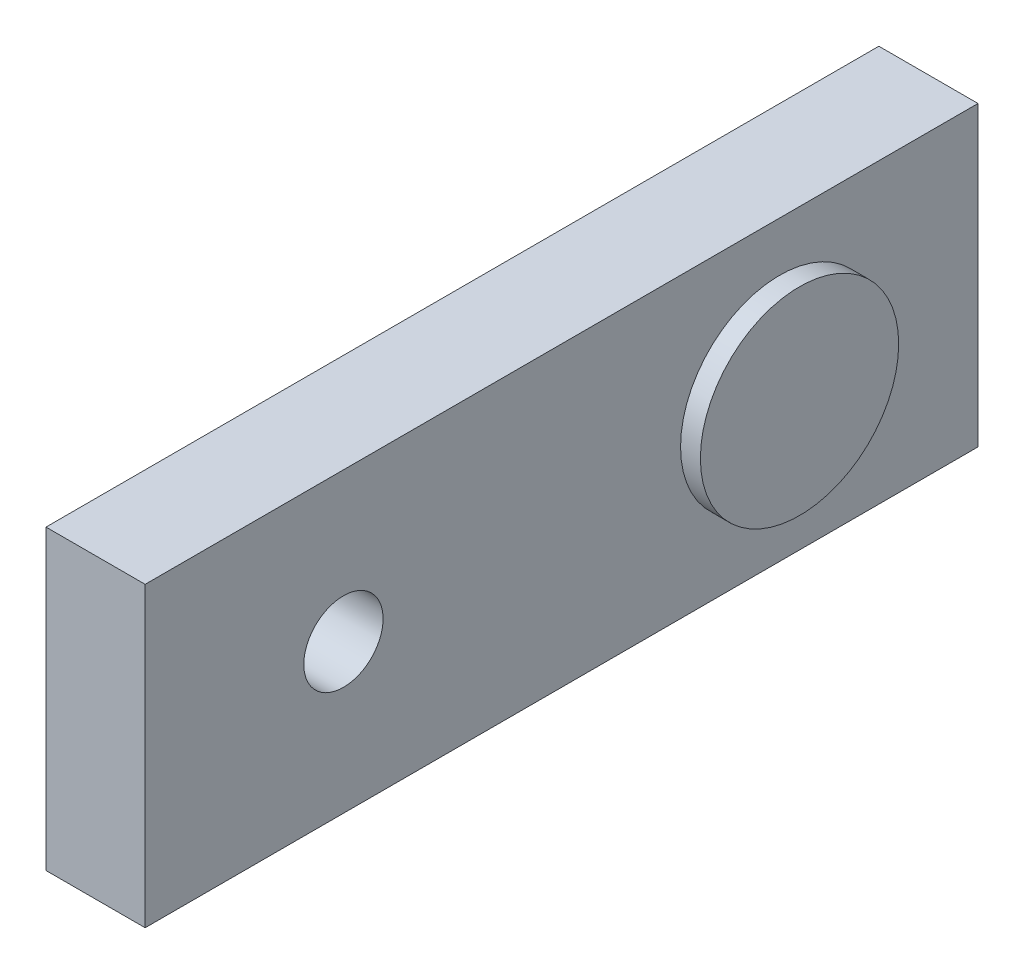
ISO-10303-21;
HEADER;
FILE_DESCRIPTION(('STEP AP214'),'2;1');
FILE_NAME('part.step','',(''),(''),'','','');
FILE_SCHEMA(('AUTOMOTIVE_DESIGN { 1 0 10303 214 1 1 1 1 }'));
ENDSEC;
DATA;
#1=APPLICATION_CONTEXT('core data for automotive mechanical design processes');
#2=APPLICATION_PROTOCOL_DEFINITION('international standard','automotive_design',2000,#1);
#3=PRODUCT_CONTEXT('',#1,'mechanical');
#4=PRODUCT('Part','Part','',(#3));
#5=PRODUCT_RELATED_PRODUCT_CATEGORY('part','',(#4));
#6=PRODUCT_DEFINITION_FORMATION('','',#4);
#7=PRODUCT_DEFINITION_CONTEXT('part definition',#1,'design');
#8=PRODUCT_DEFINITION('design','',#6,#7);
#9=PRODUCT_DEFINITION_SHAPE('','',#8);
#10=(LENGTH_UNIT() NAMED_UNIT(*) SI_UNIT(.MILLI.,.METRE.));
#11=(NAMED_UNIT(*) PLANE_ANGLE_UNIT() SI_UNIT($,.RADIAN.));
#12=(NAMED_UNIT(*) SI_UNIT($,.STERADIAN.) SOLID_ANGLE_UNIT());
#13=UNCERTAINTY_MEASURE_WITH_UNIT(LENGTH_MEASURE(1.E-05),#10,'distance_accuracy_value','');
#14=(GEOMETRIC_REPRESENTATION_CONTEXT(3) GLOBAL_UNCERTAINTY_ASSIGNED_CONTEXT((#13)) GLOBAL_UNIT_ASSIGNED_CONTEXT((#10,
#11,#12)) REPRESENTATION_CONTEXT('',''));
#15=CARTESIAN_POINT('',(0.,0.,0.));
#16=DIRECTION('',(0.,0.,1.));
#17=DIRECTION('',(1.,0.,0.));
#18=AXIS2_PLACEMENT_3D('',#15,#16,#17);
#19=CARTESIAN_POINT('',(25.,-75.,420.));
#20=DIRECTION('',(-1.,0.,0.));
#21=DIRECTION('',(0.,0.,1.));
#22=AXIS2_PLACEMENT_3D('',#19,#20,#21);
#23=PLANE('',#22);
#24=CARTESIAN_POINT('',(25.,0.,100.));
#25=DIRECTION('',(-1.,0.,0.));
#26=DIRECTION('',(0.,0.,1.));
#27=AXIS2_PLACEMENT_3D('',#24,#25,#26);
#28=CIRCLE('',#27,50.);
#29=CARTESIAN_POINT('',(25.,0.,150.));
#30=VERTEX_POINT('',#29);
#31=EDGE_CURVE('E11',#30,#30,#28,.F.);
#32=ORIENTED_EDGE('',*,*,#31,.F.);
#33=EDGE_LOOP('',(#32));
#34=FACE_BOUND('',#33,.T.);
#35=CARTESIAN_POINT('',(25.,0.,320.));
#36=DIRECTION('',(-1.,0.,0.));
#37=DIRECTION('',(0.,0.,1.));
#38=AXIS2_PLACEMENT_3D('',#35,#36,#37);
#39=CIRCLE('',#38,20.);
#40=CARTESIAN_POINT('',(25.,0.,340.));
#41=VERTEX_POINT('',#40);
#42=EDGE_CURVE('E101',#41,#41,#39,.F.);
#43=ORIENTED_EDGE('',*,*,#42,.F.);
#44=EDGE_LOOP('',(#43));
#45=FACE_BOUND('',#44,.T.);
#46=DIRECTION('',(0.,1.,0.));
#47=VECTOR('',#46,1.);
#48=CARTESIAN_POINT('',(25.,-75.,0.));
#49=LINE('',#48,#47);
#50=CARTESIAN_POINT('',(25.,-75.,0.));
#51=VERTEX_POINT('',#50);
#52=CARTESIAN_POINT('',(25.,75.,0.));
#53=VERTEX_POINT('',#52);
#54=EDGE_CURVE('E98',#51,#53,#49,.T.);
#55=ORIENTED_EDGE('',*,*,#54,.T.);
#56=DIRECTION('',(0.,0.,-1.));
#57=VECTOR('',#56,1.);
#58=CARTESIAN_POINT('',(25.,75.,420.));
#59=LINE('',#58,#57);
#60=CARTESIAN_POINT('',(25.,75.,420.));
#61=VERTEX_POINT('',#60);
#62=EDGE_CURVE('E40',#61,#53,#59,.T.);
#63=ORIENTED_EDGE('',*,*,#62,.F.);
#64=DIRECTION('',(0.,1.,0.));
#65=VECTOR('',#64,1.);
#66=CARTESIAN_POINT('',(25.,-75.,420.));
#67=LINE('',#66,#65);
#68=CARTESIAN_POINT('',(25.,-75.,420.));
#69=VERTEX_POINT('',#68);
#70=EDGE_CURVE('E84',#69,#61,#67,.T.);
#71=ORIENTED_EDGE('',*,*,#70,.F.);
#72=DIRECTION('',(0.,0.,-1.));
#73=VECTOR('',#72,1.);
#74=CARTESIAN_POINT('',(25.,-75.,420.));
#75=LINE('',#74,#73);
#76=EDGE_CURVE('E94',#69,#51,#75,.T.);
#77=ORIENTED_EDGE('',*,*,#76,.T.);
#78=EDGE_LOOP('',(#55,#63,#71,#77));
#79=FACE_BOUND('',#78,.T.);
#80=ADVANCED_FACE('F32',(#34,#45,#79),#23,.F.);
#81=CARTESIAN_POINT('',(-25.,75.,420.));
#82=DIRECTION('',(0.,-1.,0.));
#83=DIRECTION('',(0.,0.,-1.));
#84=AXIS2_PLACEMENT_3D('',#81,#82,#83);
#85=PLANE('',#84);
#86=DIRECTION('',(-1.,0.,0.));
#87=VECTOR('',#86,1.);
#88=CARTESIAN_POINT('',(-25.,75.,0.));
#89=LINE('',#88,#87);
#90=CARTESIAN_POINT('',(-25.,75.,0.));
#91=VERTEX_POINT('',#90);
#92=EDGE_CURVE('E89',#53,#91,#89,.T.);
#93=ORIENTED_EDGE('',*,*,#92,.T.);
#94=DIRECTION('',(0.,0.,-1.));
#95=VECTOR('',#94,1.);
#96=CARTESIAN_POINT('',(-25.,75.,420.));
#97=LINE('',#96,#95);
#98=CARTESIAN_POINT('',(-25.,75.,420.));
#99=VERTEX_POINT('',#98);
#100=EDGE_CURVE('E87',#99,#91,#97,.T.);
#101=ORIENTED_EDGE('',*,*,#100,.F.);
#102=DIRECTION('',(-1.,0.,0.));
#103=VECTOR('',#102,1.);
#104=CARTESIAN_POINT('',(-25.,75.,420.));
#105=LINE('',#104,#103);
#106=EDGE_CURVE('E79',#61,#99,#105,.T.);
#107=ORIENTED_EDGE('',*,*,#106,.F.);
#108=ORIENTED_EDGE('',*,*,#62,.T.);
#109=EDGE_LOOP('',(#93,#101,#107,#108));
#110=FACE_BOUND('',#109,.T.);
#111=ADVANCED_FACE('F88',(#110),#85,.F.);
#112=CARTESIAN_POINT('',(-25.,-75.,420.));
#113=DIRECTION('',(1.,0.,0.));
#114=DIRECTION('',(0.,0.,-1.));
#115=AXIS2_PLACEMENT_3D('',#112,#113,#114);
#116=PLANE('',#115);
#117=CARTESIAN_POINT('',(-25.,0.,320.));
#118=DIRECTION('',(1.,0.,0.));
#119=DIRECTION('',(0.,0.,-1.));
#120=AXIS2_PLACEMENT_3D('',#117,#118,#119);
#121=CIRCLE('',#120,20.);
#122=CARTESIAN_POINT('',(-25.,0.,300.));
#123=VERTEX_POINT('',#122);
#124=EDGE_CURVE('E107',#123,#123,#121,.F.);
#125=ORIENTED_EDGE('',*,*,#124,.F.);
#126=EDGE_LOOP('',(#125));
#127=FACE_BOUND('',#126,.T.);
#128=DIRECTION('',(0.,-1.,0.));
#129=VECTOR('',#128,1.);
#130=CARTESIAN_POINT('',(-25.,-75.,0.));
#131=LINE('',#130,#129);
#132=CARTESIAN_POINT('',(-25.,-75.,0.));
#133=VERTEX_POINT('',#132);
#134=EDGE_CURVE('E65',#91,#133,#131,.T.);
#135=ORIENTED_EDGE('',*,*,#134,.T.);
#136=DIRECTION('',(0.,0.,-1.));
#137=VECTOR('',#136,1.);
#138=CARTESIAN_POINT('',(-25.,-75.,420.));
#139=LINE('',#138,#137);
#140=CARTESIAN_POINT('',(-25.,-75.,420.));
#141=VERTEX_POINT('',#140);
#142=EDGE_CURVE('E90',#141,#133,#139,.T.);
#143=ORIENTED_EDGE('',*,*,#142,.F.);
#144=DIRECTION('',(0.,-1.,0.));
#145=VECTOR('',#144,1.);
#146=CARTESIAN_POINT('',(-25.,-75.,420.));
#147=LINE('',#146,#145);
#148=EDGE_CURVE('E82',#99,#141,#147,.T.);
#149=ORIENTED_EDGE('',*,*,#148,.F.);
#150=ORIENTED_EDGE('',*,*,#100,.T.);
#151=EDGE_LOOP('',(#135,#143,#149,#150));
#152=FACE_BOUND('',#151,.T.);
#153=ADVANCED_FACE('F92',(#127,#152),#116,.F.);
#154=CARTESIAN_POINT('',(-25.,-75.,420.));
#155=DIRECTION('',(0.,1.,0.));
#156=DIRECTION('',(0.,0.,1.));
#157=AXIS2_PLACEMENT_3D('',#154,#155,#156);
#158=PLANE('',#157);
#159=DIRECTION('',(1.,0.,0.));
#160=VECTOR('',#159,1.);
#161=CARTESIAN_POINT('',(-25.,-75.,0.));
#162=LINE('',#161,#160);
#163=EDGE_CURVE('E71',#133,#51,#162,.T.);
#164=ORIENTED_EDGE('',*,*,#163,.T.);
#165=ORIENTED_EDGE('',*,*,#76,.F.);
#166=DIRECTION('',(1.,0.,0.));
#167=VECTOR('',#166,1.);
#168=CARTESIAN_POINT('',(-25.,-75.,420.));
#169=LINE('',#168,#167);
#170=EDGE_CURVE('E48',#141,#69,#169,.T.);
#171=ORIENTED_EDGE('',*,*,#170,.F.);
#172=ORIENTED_EDGE('',*,*,#142,.T.);
#173=EDGE_LOOP('',(#164,#165,#171,#172));
#174=FACE_BOUND('',#173,.T.);
#175=ADVANCED_FACE('F141',(#174),#158,.F.);
#176=CARTESIAN_POINT('',(0.,0.,420.));
#177=DIRECTION('',(0.,0.,-1.));
#178=DIRECTION('',(-1.,0.,0.));
#179=AXIS2_PLACEMENT_3D('',#176,#177,#178);
#180=PLANE('',#179);
#181=ORIENTED_EDGE('',*,*,#70,.T.);
#182=ORIENTED_EDGE('',*,*,#106,.T.);
#183=ORIENTED_EDGE('',*,*,#148,.T.);
#184=ORIENTED_EDGE('',*,*,#170,.T.);
#185=EDGE_LOOP('',(#181,#182,#183,#184));
#186=FACE_BOUND('',#185,.T.);
#187=ADVANCED_FACE('F80',(#186),#180,.F.);
#188=CARTESIAN_POINT('',(0.,0.,0.));
#189=DIRECTION('',(0.,0.,-1.));
#190=DIRECTION('',(-1.,0.,0.));
#191=AXIS2_PLACEMENT_3D('',#188,#189,#190);
#192=PLANE('',#191);
#193=ORIENTED_EDGE('',*,*,#54,.F.);
#194=ORIENTED_EDGE('',*,*,#163,.F.);
#195=ORIENTED_EDGE('',*,*,#134,.F.);
#196=ORIENTED_EDGE('',*,*,#92,.F.);
#197=EDGE_LOOP('',(#193,#194,#195,#196));
#198=FACE_BOUND('',#197,.T.);
#199=ADVANCED_FACE('F133',(#198),#192,.T.);
#200=CARTESIAN_POINT('',(425.,0.,320.));
#201=DIRECTION('',(-1.,0.,0.));
#202=DIRECTION('',(0.,0.,1.));
#203=AXIS2_PLACEMENT_3D('',#200,#201,#202);
#204=CYLINDRICAL_SURFACE('',#203,20.);
#205=ORIENTED_EDGE('',*,*,#124,.T.);
#206=EDGE_LOOP('',(#205));
#207=FACE_BOUND('',#206,.T.);
#208=ORIENTED_EDGE('',*,*,#42,.T.);
#209=EDGE_LOOP('',(#208));
#210=FACE_BOUND('',#209,.T.);
#211=ADVANCED_FACE('F123',(#207,#210),#204,.F.);
#212=CARTESIAN_POINT('',(35.,0.,100.));
#213=DIRECTION('',(-1.,0.,0.));
#214=DIRECTION('',(0.,0.,1.));
#215=AXIS2_PLACEMENT_3D('',#212,#213,#214);
#216=CYLINDRICAL_SURFACE('',#215,50.);
#217=CARTESIAN_POINT('',(35.,0.,100.));
#218=DIRECTION('',(1.,0.,0.));
#219=DIRECTION('',(0.,0.,-1.));
#220=AXIS2_PLACEMENT_3D('',#217,#218,#219);
#221=CIRCLE('',#220,50.);
#222=CARTESIAN_POINT('',(35.,0.,50.));
#223=VERTEX_POINT('',#222);
#224=EDGE_CURVE('E109',#223,#223,#221,.T.);
#225=ORIENTED_EDGE('',*,*,#224,.F.);
#226=EDGE_LOOP('',(#225));
#227=FACE_BOUND('',#226,.T.);
#228=ORIENTED_EDGE('',*,*,#31,.T.);
#229=EDGE_LOOP('',(#228));
#230=FACE_BOUND('',#229,.T.);
#231=ADVANCED_FACE('F120',(#227,#230),#216,.T.);
#232=CARTESIAN_POINT('',(35.,0.,100.));
#233=DIRECTION('',(1.,0.,0.));
#234=DIRECTION('',(0.,0.,-1.));
#235=AXIS2_PLACEMENT_3D('',#232,#233,#234);
#236=PLANE('',#235);
#237=ORIENTED_EDGE('',*,*,#224,.T.);
#238=EDGE_LOOP('',(#237));
#239=FACE_BOUND('',#238,.T.);
#240=ADVANCED_FACE('F118',(#239),#236,.T.);
#241=CLOSED_SHELL('',(#80,#111,#153,#175,#187,#199,#211,#231,#240));
#242=MANIFOLD_SOLID_BREP('B2',#241);
#243=ADVANCED_BREP_SHAPE_REPRESENTATION('',(#18,#242),#14);
#244=SHAPE_DEFINITION_REPRESENTATION(#9,#243);
ENDSEC;
END-ISO-10303-21;
